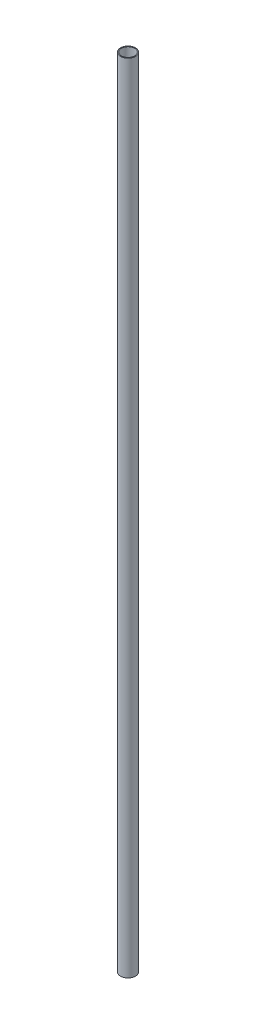
ISO-10303-21;
HEADER;
FILE_DESCRIPTION(('STEP AP214'),'2;1');
FILE_NAME('part.step','',(''),(''),'','','');
FILE_SCHEMA(('AUTOMOTIVE_DESIGN { 1 0 10303 214 1 1 1 1 }'));
ENDSEC;
DATA;
#1=APPLICATION_CONTEXT('core data for automotive mechanical design processes');
#2=APPLICATION_PROTOCOL_DEFINITION('international standard','automotive_design',2000,#1);
#3=PRODUCT_CONTEXT('',#1,'mechanical');
#4=PRODUCT('Part','Part','',(#3));
#5=PRODUCT_RELATED_PRODUCT_CATEGORY('part','',(#4));
#6=PRODUCT_DEFINITION_FORMATION('','',#4);
#7=PRODUCT_DEFINITION_CONTEXT('part definition',#1,'design');
#8=PRODUCT_DEFINITION('design','',#6,#7);
#9=PRODUCT_DEFINITION_SHAPE('','',#8);
#10=(LENGTH_UNIT() NAMED_UNIT(*) SI_UNIT(.MILLI.,.METRE.));
#11=(NAMED_UNIT(*) PLANE_ANGLE_UNIT() SI_UNIT($,.RADIAN.));
#12=(NAMED_UNIT(*) SI_UNIT($,.STERADIAN.) SOLID_ANGLE_UNIT());
#13=UNCERTAINTY_MEASURE_WITH_UNIT(LENGTH_MEASURE(1.E-05),#10,'distance_accuracy_value','');
#14=(GEOMETRIC_REPRESENTATION_CONTEXT(3) GLOBAL_UNCERTAINTY_ASSIGNED_CONTEXT((#13)) GLOBAL_UNIT_ASSIGNED_CONTEXT((#10,
#11,#12)) REPRESENTATION_CONTEXT('',''));
#15=CARTESIAN_POINT('',(0.,0.,0.));
#16=DIRECTION('',(0.,0.,1.));
#17=DIRECTION('',(1.,0.,0.));
#18=AXIS2_PLACEMENT_3D('',#15,#16,#17);
#19=CARTESIAN_POINT('',(0.,406.4,0.));
#20=DIRECTION('',(0.,1.,0.));
#21=DIRECTION('',(0.,0.,1.));
#22=AXIS2_PLACEMENT_3D('',#19,#20,#21);
#23=PLANE('',#22);
#24=CARTESIAN_POINT('',(0.,406.4,0.));
#25=DIRECTION('',(0.,1.,0.));
#26=DIRECTION('',(0.,0.,1.));
#27=AXIS2_PLACEMENT_3D('',#24,#25,#26);
#28=CIRCLE('',#27,3.81);
#29=CARTESIAN_POINT('',(0.,406.4,3.81));
#30=VERTEX_POINT('',#29);
#31=EDGE_CURVE('E10',#30,#30,#28,.T.);
#32=ORIENTED_EDGE('',*,*,#31,.T.);
#33=EDGE_LOOP('',(#32));
#34=FACE_BOUND('',#33,.T.);
#35=CARTESIAN_POINT('',(0.,406.4,0.));
#36=DIRECTION('',(0.,1.,0.));
#37=DIRECTION('',(0.,0.,1.));
#38=AXIS2_PLACEMENT_3D('',#35,#36,#37);
#39=CIRCLE('',#38,3.3655);
#40=CARTESIAN_POINT('',(0.,406.4,3.3655));
#41=VERTEX_POINT('',#40);
#42=EDGE_CURVE('E41',#41,#41,#39,.T.);
#43=ORIENTED_EDGE('',*,*,#42,.F.);
#44=EDGE_LOOP('',(#43));
#45=FACE_BOUND('',#44,.T.);
#46=ADVANCED_FACE('F30',(#34,#45),#23,.T.);
#47=CARTESIAN_POINT('',(0.,0.,0.));
#48=DIRECTION('',(0.,1.,0.));
#49=DIRECTION('',(0.,0.,1.));
#50=AXIS2_PLACEMENT_3D('',#47,#48,#49);
#51=PLANE('',#50);
#52=CARTESIAN_POINT('',(0.,0.,0.));
#53=DIRECTION('',(0.,1.,0.));
#54=DIRECTION('',(0.,0.,1.));
#55=AXIS2_PLACEMENT_3D('',#52,#53,#54);
#56=CIRCLE('',#55,3.81);
#57=CARTESIAN_POINT('',(0.,0.,3.81));
#58=VERTEX_POINT('',#57);
#59=EDGE_CURVE('E34',#58,#58,#56,.T.);
#60=ORIENTED_EDGE('',*,*,#59,.F.);
#61=EDGE_LOOP('',(#60));
#62=FACE_BOUND('',#61,.T.);
#63=CARTESIAN_POINT('',(0.,0.,0.));
#64=DIRECTION('',(0.,1.,0.));
#65=DIRECTION('',(0.,0.,1.));
#66=AXIS2_PLACEMENT_3D('',#63,#64,#65);
#67=CIRCLE('',#66,3.3655);
#68=CARTESIAN_POINT('',(0.,0.,3.3655));
#69=VERTEX_POINT('',#68);
#70=EDGE_CURVE('E43',#69,#69,#67,.T.);
#71=ORIENTED_EDGE('',*,*,#70,.T.);
#72=EDGE_LOOP('',(#71));
#73=FACE_BOUND('',#72,.T.);
#74=ADVANCED_FACE('F53',(#62,#73),#51,.F.);
#75=CARTESIAN_POINT('',(0.,406.4,0.));
#76=DIRECTION('',(0.,-1.,0.));
#77=DIRECTION('',(0.,0.,-1.));
#78=AXIS2_PLACEMENT_3D('',#75,#76,#77);
#79=CYLINDRICAL_SURFACE('',#78,3.81);
#80=ORIENTED_EDGE('',*,*,#31,.F.);
#81=EDGE_LOOP('',(#80));
#82=FACE_BOUND('',#81,.T.);
#83=ORIENTED_EDGE('',*,*,#59,.T.);
#84=EDGE_LOOP('',(#83));
#85=FACE_BOUND('',#84,.T.);
#86=ADVANCED_FACE('F32',(#82,#85),#79,.T.);
#87=CARTESIAN_POINT('',(0.,406.4,0.));
#88=DIRECTION('',(0.,-1.,0.));
#89=DIRECTION('',(0.,0.,-1.));
#90=AXIS2_PLACEMENT_3D('',#87,#88,#89);
#91=CYLINDRICAL_SURFACE('',#90,3.3655);
#92=ORIENTED_EDGE('',*,*,#42,.T.);
#93=EDGE_LOOP('',(#92));
#94=FACE_BOUND('',#93,.T.);
#95=ORIENTED_EDGE('',*,*,#70,.F.);
#96=EDGE_LOOP('',(#95));
#97=FACE_BOUND('',#96,.T.);
#98=ADVANCED_FACE('F49',(#94,#97),#91,.F.);
#99=CLOSED_SHELL('',(#46,#74,#86,#98));
#100=MANIFOLD_SOLID_BREP('B2',#99);
#101=ADVANCED_BREP_SHAPE_REPRESENTATION('',(#18,#100),#14);
#102=SHAPE_DEFINITION_REPRESENTATION(#9,#101);
ENDSEC;
END-ISO-10303-21;
